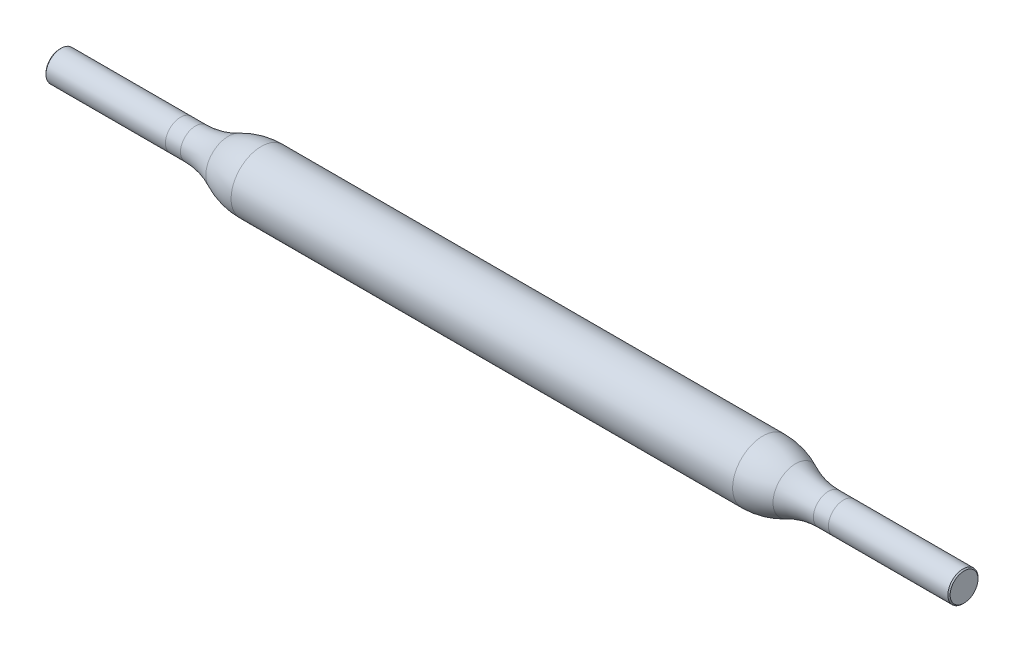
ISO-10303-21;
HEADER;
FILE_DESCRIPTION(('STEP AP214'),'2;1');
FILE_NAME('part.step','',(''),(''),'','','');
FILE_SCHEMA(('AUTOMOTIVE_DESIGN { 1 0 10303 214 1 1 1 1 }'));
ENDSEC;
DATA;
#1=APPLICATION_CONTEXT('core data for automotive mechanical design processes');
#2=APPLICATION_PROTOCOL_DEFINITION('international standard','automotive_design',2000,#1);
#3=PRODUCT_CONTEXT('',#1,'mechanical');
#4=PRODUCT('Part','Part','',(#3));
#5=PRODUCT_RELATED_PRODUCT_CATEGORY('part','',(#4));
#6=PRODUCT_DEFINITION_FORMATION('','',#4);
#7=PRODUCT_DEFINITION_CONTEXT('part definition',#1,'design');
#8=PRODUCT_DEFINITION('design','',#6,#7);
#9=PRODUCT_DEFINITION_SHAPE('','',#8);
#10=(LENGTH_UNIT() NAMED_UNIT(*) SI_UNIT(.MILLI.,.METRE.));
#11=(NAMED_UNIT(*) PLANE_ANGLE_UNIT() SI_UNIT($,.RADIAN.));
#12=(NAMED_UNIT(*) SI_UNIT($,.STERADIAN.) SOLID_ANGLE_UNIT());
#13=UNCERTAINTY_MEASURE_WITH_UNIT(LENGTH_MEASURE(1.E-05),#10,'distance_accuracy_value','');
#14=(GEOMETRIC_REPRESENTATION_CONTEXT(3) GLOBAL_UNCERTAINTY_ASSIGNED_CONTEXT((#13)) GLOBAL_UNIT_ASSIGNED_CONTEXT((#10,
#11,#12)) REPRESENTATION_CONTEXT('',''));
#15=CARTESIAN_POINT('',(0.,0.,0.));
#16=DIRECTION('',(0.,0.,1.));
#17=DIRECTION('',(1.,0.,0.));
#18=AXIS2_PLACEMENT_3D('',#15,#16,#17);
#19=CARTESIAN_POINT('',(-30.,0.,0.));
#20=DIRECTION('',(-1.,0.,0.));
#21=DIRECTION('',(0.,-1.,0.));
#22=AXIS2_PLACEMENT_3D('',#19,#20,#21);
#23=CYLINDRICAL_SURFACE('',#22,0.999999999999999);
#24=CARTESIAN_POINT('',(21.,0.,0.));
#25=DIRECTION('',(-1.,0.,0.));
#26=DIRECTION('',(0.,-1.,0.));
#27=AXIS2_PLACEMENT_3D('',#24,#25,#26);
#28=CIRCLE('',#27,0.999999999999999);
#29=CARTESIAN_POINT('',(21.,-1.,0.));
#30=VERTEX_POINT('',#29);
#31=EDGE_CURVE('E86',#30,#30,#28,.T.);
#32=ORIENTED_EDGE('',*,*,#31,.F.);
#33=EDGE_LOOP('',(#32));
#34=FACE_BOUND('',#33,.T.);
#35=CARTESIAN_POINT('',(22.,0.,0.));
#36=DIRECTION('',(1.,0.,0.));
#37=DIRECTION('',(0.,0.,-1.));
#38=AXIS2_PLACEMENT_3D('',#35,#36,#37);
#39=CIRCLE('',#38,0.999999999999999);
#40=CARTESIAN_POINT('',(22.,0.,-0.999999999999999));
#41=VERTEX_POINT('',#40);
#42=EDGE_CURVE('E78',#41,#41,#39,.T.);
#43=ORIENTED_EDGE('',*,*,#42,.F.);
#44=EDGE_LOOP('',(#43));
#45=FACE_BOUND('',#44,.T.);
#46=ADVANCED_FACE('F53',(#34,#45),#23,.T.);
#47=CARTESIAN_POINT('',(-30.,0.,0.));
#48=DIRECTION('',(-1.,0.,0.));
#49=DIRECTION('',(0.,-1.,0.));
#50=AXIS2_PLACEMENT_3D('',#47,#48,#49);
#51=CYLINDRICAL_SURFACE('',#50,1.);
#52=CARTESIAN_POINT('',(-29.925,0.,0.));
#53=DIRECTION('',(1.,0.,0.));
#54=DIRECTION('',(0.,1.,0.));
#55=AXIS2_PLACEMENT_3D('',#52,#53,#54);
#56=CIRCLE('',#55,1.);
#57=CARTESIAN_POINT('',(-29.925,1.,0.));
#58=VERTEX_POINT('',#57);
#59=EDGE_CURVE('E67',#58,#58,#56,.T.);
#60=ORIENTED_EDGE('',*,*,#59,.T.);
#61=EDGE_LOOP('',(#60));
#62=FACE_BOUND('',#61,.T.);
#63=CARTESIAN_POINT('',(-22.,0.,0.));
#64=DIRECTION('',(1.,0.,0.));
#65=DIRECTION('',(0.,0.,-1.));
#66=AXIS2_PLACEMENT_3D('',#63,#64,#65);
#67=CIRCLE('',#66,1.);
#68=CARTESIAN_POINT('',(-22.,0.,-1.));
#69=VERTEX_POINT('',#68);
#70=EDGE_CURVE('E82',#69,#69,#67,.T.);
#71=ORIENTED_EDGE('',*,*,#70,.F.);
#72=EDGE_LOOP('',(#71));
#73=FACE_BOUND('',#72,.T.);
#74=ADVANCED_FACE('F146',(#62,#73),#51,.T.);
#75=CARTESIAN_POINT('',(-30.,0.,0.));
#76=DIRECTION('',(1.,0.,0.));
#77=DIRECTION('',(0.,1.,0.));
#78=AXIS2_PLACEMENT_3D('',#75,#76,#77);
#79=PLANE('',#78);
#80=CARTESIAN_POINT('',(-30.,0.,0.));
#81=DIRECTION('',(1.,0.,0.));
#82=DIRECTION('',(0.,1.,0.));
#83=AXIS2_PLACEMENT_3D('',#80,#81,#82);
#84=CIRCLE('',#83,0.925000000000016);
#85=CARTESIAN_POINT('',(-30.,0.925000000000016,0.));
#86=VERTEX_POINT('',#85);
#87=EDGE_CURVE('E72',#86,#86,#84,.F.);
#88=ORIENTED_EDGE('',*,*,#87,.T.);
#89=EDGE_LOOP('',(#88));
#90=FACE_BOUND('',#89,.T.);
#91=ADVANCED_FACE('F156',(#90),#79,.F.);
#92=CARTESIAN_POINT('',(30.,0.,0.));
#93=DIRECTION('',(-1.,0.,0.));
#94=DIRECTION('',(0.,-1.,0.));
#95=AXIS2_PLACEMENT_3D('',#92,#93,#94);
#96=PLANE('',#95);
#97=CARTESIAN_POINT('',(30.,0.,0.));
#98=DIRECTION('',(-1.,0.,0.));
#99=DIRECTION('',(0.,-1.,0.));
#100=AXIS2_PLACEMENT_3D('',#97,#98,#99);
#101=CIRCLE('',#100,0.925000000000002);
#102=CARTESIAN_POINT('',(30.,-0.925000000000006,0.));
#103=VERTEX_POINT('',#102);
#104=EDGE_CURVE('E10',#103,#103,#101,.F.);
#105=ORIENTED_EDGE('',*,*,#104,.T.);
#106=EDGE_LOOP('',(#105));
#107=FACE_BOUND('',#106,.T.);
#108=ADVANCED_FACE('F151',(#107),#96,.F.);
#109=CARTESIAN_POINT('',(29.925,0.,0.));
#110=DIRECTION('',(-1.,0.,0.));
#111=DIRECTION('',(0.,-1.,0.));
#112=AXIS2_PLACEMENT_3D('',#109,#110,#111);
#113=CIRCLE('',#112,0.999999999999999);
#114=CARTESIAN_POINT('',(29.925,-1.,0.));
#115=VERTEX_POINT('',#114);
#116=EDGE_CURVE('E62',#115,#115,#113,.T.);
#117=ORIENTED_EDGE('',*,*,#116,.T.);
#118=EDGE_LOOP('',(#117));
#119=FACE_BOUND('',#118,.T.);
#120=ORIENTED_EDGE('',*,*,#42,.T.);
#121=EDGE_LOOP('',(#120));
#122=FACE_BOUND('',#121,.T.);
#123=ADVANCED_FACE('F140',(#119,#122),#23,.T.);
#124=CARTESIAN_POINT('',(21.,0.,0.));
#125=DIRECTION('',(-1.,0.,0.));
#126=DIRECTION('',(0.,-1.,0.));
#127=AXIS2_PLACEMENT_3D('',#124,#125,#126);
#128=TOROIDAL_SURFACE('',#127,5.99999999999997,4.99999999999997);
#129=CARTESIAN_POINT('',(18.8205505282297,0.,0.));
#130=DIRECTION('',(-1.,0.,0.));
#131=DIRECTION('',(0.,-1.,0.));
#132=AXIS2_PLACEMENT_3D('',#129,#130,#131);
#133=CIRCLE('',#132,1.5);
#134=CARTESIAN_POINT('',(18.8205505282297,-1.5,0.));
#135=VERTEX_POINT('',#134);
#136=EDGE_CURVE('E90',#135,#135,#133,.T.);
#137=ORIENTED_EDGE('',*,*,#136,.F.);
#138=EDGE_LOOP('',(#137));
#139=FACE_BOUND('',#138,.T.);
#140=ORIENTED_EDGE('',*,*,#31,.T.);
#141=EDGE_LOOP('',(#140));
#142=FACE_BOUND('',#141,.T.);
#143=ADVANCED_FACE('F134',(#139,#142),#128,.F.);
#144=CARTESIAN_POINT('',(16.6411010564593,0.,0.));
#145=DIRECTION('',(-1.,0.,0.));
#146=DIRECTION('',(0.,-1.,0.));
#147=AXIS2_PLACEMENT_3D('',#144,#145,#146);
#148=DEGENERATE_TOROIDAL_SURFACE('',#147,3.,5.,.F.);
#149=CARTESIAN_POINT('',(16.6411010564593,0.,0.));
#150=DIRECTION('',(-1.,0.,0.));
#151=DIRECTION('',(0.,-1.,0.));
#152=AXIS2_PLACEMENT_3D('',#149,#150,#151);
#153=CIRCLE('',#152,2.);
#154=CARTESIAN_POINT('',(16.6411010564593,-2.00000000000001,0.));
#155=VERTEX_POINT('',#154);
#156=EDGE_CURVE('E94',#155,#155,#153,.T.);
#157=ORIENTED_EDGE('',*,*,#156,.F.);
#158=EDGE_LOOP('',(#157));
#159=FACE_BOUND('',#158,.T.);
#160=ORIENTED_EDGE('',*,*,#136,.T.);
#161=EDGE_LOOP('',(#160));
#162=FACE_BOUND('',#161,.T.);
#163=ADVANCED_FACE('F128',(#159,#162),#148,.F.);
#164=CARTESIAN_POINT('',(-30.,0.,0.));
#165=DIRECTION('',(-1.,0.,0.));
#166=DIRECTION('',(0.,-1.,0.));
#167=AXIS2_PLACEMENT_3D('',#164,#165,#166);
#168=CYLINDRICAL_SURFACE('',#167,2.);
#169=CARTESIAN_POINT('',(-16.6411010564593,0.,0.));
#170=DIRECTION('',(-1.,0.,0.));
#171=DIRECTION('',(0.,-1.,0.));
#172=AXIS2_PLACEMENT_3D('',#169,#170,#171);
#173=CIRCLE('',#172,2.);
#174=CARTESIAN_POINT('',(-16.6411010564593,-2.,0.));
#175=VERTEX_POINT('',#174);
#176=EDGE_CURVE('E98',#175,#175,#173,.T.);
#177=ORIENTED_EDGE('',*,*,#176,.F.);
#178=EDGE_LOOP('',(#177));
#179=FACE_BOUND('',#178,.T.);
#180=ORIENTED_EDGE('',*,*,#156,.T.);
#181=EDGE_LOOP('',(#180));
#182=FACE_BOUND('',#181,.T.);
#183=ADVANCED_FACE('F122',(#179,#182),#168,.T.);
#184=CARTESIAN_POINT('',(-16.6411010564593,0.,0.));
#185=DIRECTION('',(-1.,0.,0.));
#186=DIRECTION('',(0.,-1.,0.));
#187=AXIS2_PLACEMENT_3D('',#184,#185,#186);
#188=DEGENERATE_TOROIDAL_SURFACE('',#187,3.,5.,.F.);
#189=CARTESIAN_POINT('',(-18.8205505282297,0.,0.));
#190=DIRECTION('',(-1.,0.,0.));
#191=DIRECTION('',(0.,-1.,0.));
#192=AXIS2_PLACEMENT_3D('',#189,#190,#191);
#193=CIRCLE('',#192,1.5);
#194=CARTESIAN_POINT('',(-18.8205505282297,-1.5,0.));
#195=VERTEX_POINT('',#194);
#196=EDGE_CURVE('E102',#195,#195,#193,.T.);
#197=ORIENTED_EDGE('',*,*,#196,.F.);
#198=EDGE_LOOP('',(#197));
#199=FACE_BOUND('',#198,.T.);
#200=ORIENTED_EDGE('',*,*,#176,.T.);
#201=EDGE_LOOP('',(#200));
#202=FACE_BOUND('',#201,.T.);
#203=ADVANCED_FACE('F116',(#199,#202),#188,.F.);
#204=CARTESIAN_POINT('',(-21.,0.,0.));
#205=DIRECTION('',(-1.,0.,0.));
#206=DIRECTION('',(0.,-1.,0.));
#207=AXIS2_PLACEMENT_3D('',#204,#205,#206);
#208=TOROIDAL_SURFACE('',#207,6.00000000000001,5.);
#209=CARTESIAN_POINT('',(-21.,0.,0.));
#210=DIRECTION('',(-1.,0.,0.));
#211=DIRECTION('',(0.,-1.,0.));
#212=AXIS2_PLACEMENT_3D('',#209,#210,#211);
#213=CIRCLE('',#212,1.);
#214=CARTESIAN_POINT('',(-21.,-1.,0.));
#215=VERTEX_POINT('',#214);
#216=EDGE_CURVE('E106',#215,#215,#213,.T.);
#217=ORIENTED_EDGE('',*,*,#216,.F.);
#218=EDGE_LOOP('',(#217));
#219=FACE_BOUND('',#218,.T.);
#220=ORIENTED_EDGE('',*,*,#196,.T.);
#221=EDGE_LOOP('',(#220));
#222=FACE_BOUND('',#221,.T.);
#223=ADVANCED_FACE('F113',(#219,#222),#208,.F.);
#224=ORIENTED_EDGE('',*,*,#70,.T.);
#225=EDGE_LOOP('',(#224));
#226=FACE_BOUND('',#225,.T.);
#227=ORIENTED_EDGE('',*,*,#216,.T.);
#228=EDGE_LOOP('',(#227));
#229=FACE_BOUND('',#228,.T.);
#230=ADVANCED_FACE('F111',(#226,#229),#51,.T.);
#231=CARTESIAN_POINT('',(-30.,0.,0.));
#232=DIRECTION('',(1.,0.,0.));
#233=DIRECTION('',(0.,1.,0.));
#234=AXIS2_PLACEMENT_3D('',#231,#232,#233);
#235=CONICAL_SURFACE('',#234,0.925000000000016,0.785398163397471);
#236=ORIENTED_EDGE('',*,*,#59,.F.);
#237=EDGE_LOOP('',(#236));
#238=FACE_BOUND('',#237,.T.);
#239=ORIENTED_EDGE('',*,*,#87,.F.);
#240=EDGE_LOOP('',(#239));
#241=FACE_BOUND('',#240,.T.);
#242=ADVANCED_FACE('F162',(#238,#241),#235,.T.);
#243=CARTESIAN_POINT('',(29.925,0.,0.));
#244=DIRECTION('',(-1.,0.,0.));
#245=DIRECTION('',(0.,-1.,0.));
#246=AXIS2_PLACEMENT_3D('',#243,#244,#245);
#247=CONICAL_SURFACE('',#246,0.999999999999999,0.785398163397437);
#248=ORIENTED_EDGE('',*,*,#104,.F.);
#249=EDGE_LOOP('',(#248));
#250=FACE_BOUND('',#249,.T.);
#251=ORIENTED_EDGE('',*,*,#116,.F.);
#252=EDGE_LOOP('',(#251));
#253=FACE_BOUND('',#252,.T.);
#254=ADVANCED_FACE('F56',(#250,#253),#247,.T.);
#255=CLOSED_SHELL('',(#46,#74,#91,#108,#123,#143,#163,#183,#203,#223,#230,#242,#254));
#256=MANIFOLD_SOLID_BREP('B2',#255);
#257=ADVANCED_BREP_SHAPE_REPRESENTATION('',(#18,#256),#14);
#258=SHAPE_DEFINITION_REPRESENTATION(#9,#257);
ENDSEC;
END-ISO-10303-21;
